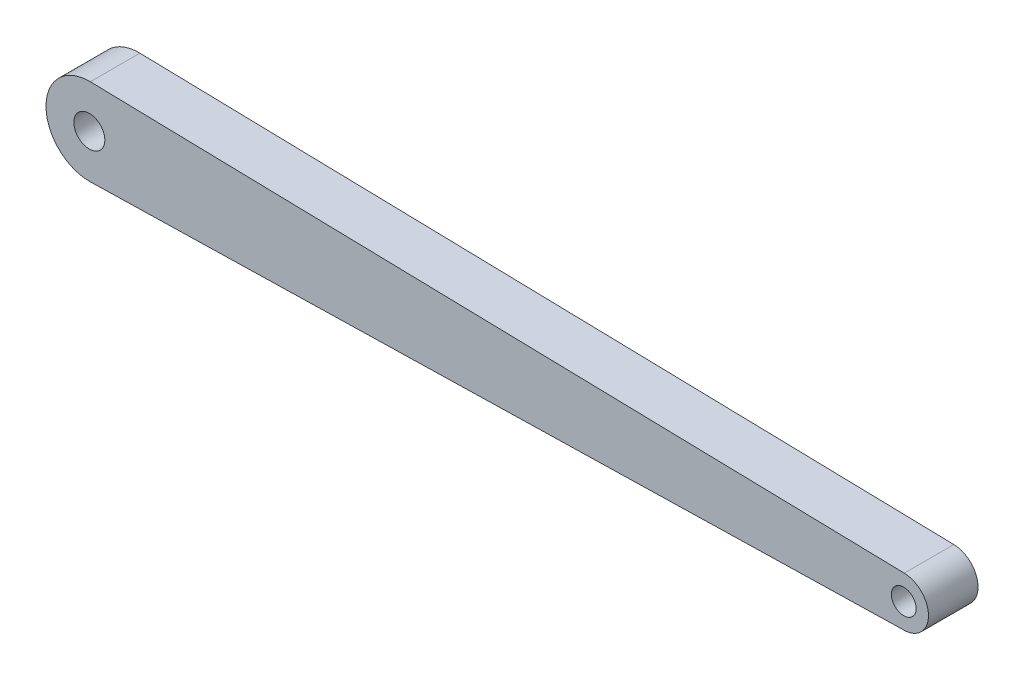
ISO-10303-21;
HEADER;
FILE_DESCRIPTION(('STEP AP214'),'2;1');
FILE_NAME('part.step','',(''),(''),'','','');
FILE_SCHEMA(('AUTOMOTIVE_DESIGN { 1 0 10303 214 1 1 1 1 }'));
ENDSEC;
DATA;
#1=APPLICATION_CONTEXT('core data for automotive mechanical design processes');
#2=APPLICATION_PROTOCOL_DEFINITION('international standard','automotive_design',2000,#1);
#3=PRODUCT_CONTEXT('',#1,'mechanical');
#4=PRODUCT('Part','Part','',(#3));
#5=PRODUCT_RELATED_PRODUCT_CATEGORY('part','',(#4));
#6=PRODUCT_DEFINITION_FORMATION('','',#4);
#7=PRODUCT_DEFINITION_CONTEXT('part definition',#1,'design');
#8=PRODUCT_DEFINITION('design','',#6,#7);
#9=PRODUCT_DEFINITION_SHAPE('','',#8);
#10=(LENGTH_UNIT() NAMED_UNIT(*) SI_UNIT(.MILLI.,.METRE.));
#11=(NAMED_UNIT(*) PLANE_ANGLE_UNIT() SI_UNIT($,.RADIAN.));
#12=(NAMED_UNIT(*) SI_UNIT($,.STERADIAN.) SOLID_ANGLE_UNIT());
#13=UNCERTAINTY_MEASURE_WITH_UNIT(LENGTH_MEASURE(1.E-05),#10,'distance_accuracy_value','');
#14=(GEOMETRIC_REPRESENTATION_CONTEXT(3) GLOBAL_UNCERTAINTY_ASSIGNED_CONTEXT((#13)) GLOBAL_UNIT_ASSIGNED_CONTEXT((#10,
#11,#12)) REPRESENTATION_CONTEXT('',''));
#15=CARTESIAN_POINT('',(0.,0.,0.));
#16=DIRECTION('',(0.,0.,1.));
#17=DIRECTION('',(1.,0.,0.));
#18=AXIS2_PLACEMENT_3D('',#15,#16,#17);
#19=CARTESIAN_POINT('',(-1315.,0.,40.));
#20=DIRECTION('',(0.,0.,1.));
#21=DIRECTION('',(1.,0.,0.));
#22=AXIS2_PLACEMENT_3D('',#19,#20,#21);
#23=PLANE('',#22);
#24=CARTESIAN_POINT('',(0.,0.,40.));
#25=DIRECTION('',(0.,0.,1.));
#26=DIRECTION('',(1.,0.,0.));
#27=AXIS2_PLACEMENT_3D('',#24,#25,#26);
#28=CIRCLE('',#27,20.);
#29=CARTESIAN_POINT('',(20.,0.,40.));
#30=VERTEX_POINT('',#29);
#31=EDGE_CURVE('E106',#30,#30,#28,.T.);
#32=ORIENTED_EDGE('',*,*,#31,.F.);
#33=EDGE_LOOP('',(#32));
#34=FACE_BOUND('',#33,.T.);
#35=CARTESIAN_POINT('',(-1315.,0.,40.));
#36=DIRECTION('',(0.,0.,1.));
#37=DIRECTION('',(1.,0.,0.));
#38=AXIS2_PLACEMENT_3D('',#35,#36,#37);
#39=CIRCLE('',#38,70.);
#40=CARTESIAN_POINT('',(-1313.40304182509,69.9817813762095,40.));
#41=VERTEX_POINT('',#40);
#42=CARTESIAN_POINT('',(-1313.40304182509,-69.9817813762098,40.));
#43=VERTEX_POINT('',#42);
#44=EDGE_CURVE('E91',#41,#43,#39,.T.);
#45=ORIENTED_EDGE('',*,*,#44,.T.);
#46=DIRECTION('',(0.999739733945852,0.0228136882129279,0.));
#47=VECTOR('',#46,1.);
#48=CARTESIAN_POINT('',(-1313.40304182509,-69.9817813762098,40.));
#49=LINE('',#48,#47);
#50=CARTESIAN_POINT('',(0.912547528517138,-39.9895893578341,40.));
#51=VERTEX_POINT('',#50);
#52=EDGE_CURVE('E86',#43,#51,#49,.T.);
#53=ORIENTED_EDGE('',*,*,#52,.T.);
#54=CARTESIAN_POINT('',(0.,0.,40.));
#55=DIRECTION('',(0.,0.,1.));
#56=DIRECTION('',(-1.,0.,0.));
#57=AXIS2_PLACEMENT_3D('',#54,#55,#56);
#58=CIRCLE('',#57,40.);
#59=CARTESIAN_POINT('',(0.912547528517105,39.9895893578341,40.));
#60=VERTEX_POINT('',#59);
#61=EDGE_CURVE('E89',#51,#60,#58,.T.);
#62=ORIENTED_EDGE('',*,*,#61,.T.);
#63=DIRECTION('',(-0.999739733945852,0.0228136882129276,0.));
#64=VECTOR('',#63,1.);
#65=CARTESIAN_POINT('',(-1313.40304182509,69.9817813762095,40.));
#66=LINE('',#65,#64);
#67=EDGE_CURVE('E56',#60,#41,#66,.T.);
#68=ORIENTED_EDGE('',*,*,#67,.T.);
#69=EDGE_LOOP('',(#45,#53,#62,#68));
#70=FACE_BOUND('',#69,.T.);
#71=CARTESIAN_POINT('',(-1315.,0.,40.));
#72=DIRECTION('',(0.,0.,1.));
#73=DIRECTION('',(1.,0.,0.));
#74=AXIS2_PLACEMENT_3D('',#71,#72,#73);
#75=CIRCLE('',#74,25.);
#76=CARTESIAN_POINT('',(-1290.,0.,40.));
#77=VERTEX_POINT('',#76);
#78=EDGE_CURVE('E121',#77,#77,#75,.T.);
#79=ORIENTED_EDGE('',*,*,#78,.F.);
#80=EDGE_LOOP('',(#79));
#81=FACE_BOUND('',#80,.T.);
#82=ADVANCED_FACE('F39',(#34,#70,#81),#23,.T.);
#83=CARTESIAN_POINT('',(-1315.,0.,-40.));
#84=DIRECTION('',(0.,0.,1.));
#85=DIRECTION('',(1.,0.,0.));
#86=AXIS2_PLACEMENT_3D('',#83,#84,#85);
#87=PLANE('',#86);
#88=CARTESIAN_POINT('',(-1315.,0.,-40.));
#89=DIRECTION('',(0.,0.,1.));
#90=DIRECTION('',(1.,0.,0.));
#91=AXIS2_PLACEMENT_3D('',#88,#89,#90);
#92=CIRCLE('',#91,70.);
#93=CARTESIAN_POINT('',(-1313.40304182509,69.9817813762095,-40.));
#94=VERTEX_POINT('',#93);
#95=CARTESIAN_POINT('',(-1313.40304182509,-69.9817813762098,-40.));
#96=VERTEX_POINT('',#95);
#97=EDGE_CURVE('E103',#94,#96,#92,.T.);
#98=ORIENTED_EDGE('',*,*,#97,.F.);
#99=DIRECTION('',(-0.999739733945852,0.0228136882129276,0.));
#100=VECTOR('',#99,1.);
#101=CARTESIAN_POINT('',(-1313.40304182509,69.9817813762095,-40.));
#102=LINE('',#101,#100);
#103=CARTESIAN_POINT('',(0.912547528517105,39.9895893578341,-40.));
#104=VERTEX_POINT('',#103);
#105=EDGE_CURVE('E79',#104,#94,#102,.T.);
#106=ORIENTED_EDGE('',*,*,#105,.F.);
#107=CARTESIAN_POINT('',(0.,0.,-40.));
#108=DIRECTION('',(0.,0.,1.));
#109=DIRECTION('',(-1.,0.,0.));
#110=AXIS2_PLACEMENT_3D('',#107,#108,#109);
#111=CIRCLE('',#110,40.);
#112=CARTESIAN_POINT('',(0.912547528517138,-39.9895893578341,-40.));
#113=VERTEX_POINT('',#112);
#114=EDGE_CURVE('E73',#113,#104,#111,.T.);
#115=ORIENTED_EDGE('',*,*,#114,.F.);
#116=DIRECTION('',(0.999739733945852,0.0228136882129279,0.));
#117=VECTOR('',#116,1.);
#118=CARTESIAN_POINT('',(-1313.40304182509,-69.9817813762098,-40.));
#119=LINE('',#118,#117);
#120=EDGE_CURVE('E95',#96,#113,#119,.T.);
#121=ORIENTED_EDGE('',*,*,#120,.F.);
#122=EDGE_LOOP('',(#98,#106,#115,#121));
#123=FACE_BOUND('',#122,.T.);
#124=CARTESIAN_POINT('',(0.,0.,-40.));
#125=DIRECTION('',(0.,0.,1.));
#126=DIRECTION('',(1.,0.,0.));
#127=AXIS2_PLACEMENT_3D('',#124,#125,#126);
#128=CIRCLE('',#127,20.);
#129=CARTESIAN_POINT('',(20.,0.,-40.));
#130=VERTEX_POINT('',#129);
#131=EDGE_CURVE('E118',#130,#130,#128,.T.);
#132=ORIENTED_EDGE('',*,*,#131,.T.);
#133=EDGE_LOOP('',(#132));
#134=FACE_BOUND('',#133,.T.);
#135=CARTESIAN_POINT('',(-1315.,0.,-40.));
#136=DIRECTION('',(0.,0.,1.));
#137=DIRECTION('',(1.,0.,0.));
#138=AXIS2_PLACEMENT_3D('',#135,#136,#137);
#139=CIRCLE('',#138,25.);
#140=CARTESIAN_POINT('',(-1290.,0.,-40.));
#141=VERTEX_POINT('',#140);
#142=EDGE_CURVE('E124',#141,#141,#139,.T.);
#143=ORIENTED_EDGE('',*,*,#142,.T.);
#144=EDGE_LOOP('',(#143));
#145=FACE_BOUND('',#144,.T.);
#146=ADVANCED_FACE('F114',(#123,#134,#145),#87,.F.);
#147=CARTESIAN_POINT('',(-1315.,0.,40.));
#148=DIRECTION('',(0.,0.,-1.));
#149=DIRECTION('',(-1.,0.,0.));
#150=AXIS2_PLACEMENT_3D('',#147,#148,#149);
#151=CYLINDRICAL_SURFACE('',#150,70.);
#152=ORIENTED_EDGE('',*,*,#97,.T.);
#153=DIRECTION('',(0.,0.,-1.));
#154=VECTOR('',#153,1.);
#155=CARTESIAN_POINT('',(-1313.40304182509,-69.9817813762098,40.));
#156=LINE('',#155,#154);
#157=EDGE_CURVE('E11',#43,#96,#156,.T.);
#158=ORIENTED_EDGE('',*,*,#157,.F.);
#159=ORIENTED_EDGE('',*,*,#44,.F.);
#160=DIRECTION('',(0.,0.,-1.));
#161=VECTOR('',#160,1.);
#162=CARTESIAN_POINT('',(-1313.40304182509,69.9817813762095,40.));
#163=LINE('',#162,#161);
#164=EDGE_CURVE('E99',#41,#94,#163,.T.);
#165=ORIENTED_EDGE('',*,*,#164,.T.);
#166=EDGE_LOOP('',(#152,#158,#159,#165));
#167=FACE_BOUND('',#166,.T.);
#168=ADVANCED_FACE('F41',(#167),#151,.T.);
#169=CARTESIAN_POINT('',(-1313.40304182509,-69.9817813762098,40.));
#170=DIRECTION('',(-0.0228136882129279,0.999739733945852,0.));
#171=DIRECTION('',(-0.999739733945852,-0.0228136882129279,0.));
#172=AXIS2_PLACEMENT_3D('',#169,#170,#171);
#173=PLANE('',#172);
#174=ORIENTED_EDGE('',*,*,#120,.T.);
#175=DIRECTION('',(0.,0.,-1.));
#176=VECTOR('',#175,1.);
#177=CARTESIAN_POINT('',(0.912547528517138,-39.9895893578341,40.));
#178=LINE('',#177,#176);
#179=EDGE_CURVE('E48',#51,#113,#178,.T.);
#180=ORIENTED_EDGE('',*,*,#179,.F.);
#181=ORIENTED_EDGE('',*,*,#52,.F.);
#182=ORIENTED_EDGE('',*,*,#157,.T.);
#183=EDGE_LOOP('',(#174,#180,#181,#182));
#184=FACE_BOUND('',#183,.T.);
#185=ADVANCED_FACE('F94',(#184),#173,.F.);
#186=CARTESIAN_POINT('',(0.,0.,40.));
#187=DIRECTION('',(0.,0.,-1.));
#188=DIRECTION('',(-1.,0.,0.));
#189=AXIS2_PLACEMENT_3D('',#186,#187,#188);
#190=CYLINDRICAL_SURFACE('',#189,40.);
#191=ORIENTED_EDGE('',*,*,#114,.T.);
#192=DIRECTION('',(0.,0.,-1.));
#193=VECTOR('',#192,1.);
#194=CARTESIAN_POINT('',(0.912547528517105,39.9895893578341,40.));
#195=LINE('',#194,#193);
#196=EDGE_CURVE('E96',#60,#104,#195,.T.);
#197=ORIENTED_EDGE('',*,*,#196,.F.);
#198=ORIENTED_EDGE('',*,*,#61,.F.);
#199=ORIENTED_EDGE('',*,*,#179,.T.);
#200=EDGE_LOOP('',(#191,#197,#198,#199));
#201=FACE_BOUND('',#200,.T.);
#202=ADVANCED_FACE('F97',(#201),#190,.T.);
#203=CARTESIAN_POINT('',(-1313.40304182509,69.9817813762095,40.));
#204=DIRECTION('',(-0.0228136882129276,-0.999739733945852,0.));
#205=DIRECTION('',(0.999739733945852,-0.0228136882129276,0.));
#206=AXIS2_PLACEMENT_3D('',#203,#204,#205);
#207=PLANE('',#206);
#208=ORIENTED_EDGE('',*,*,#105,.T.);
#209=ORIENTED_EDGE('',*,*,#164,.F.);
#210=ORIENTED_EDGE('',*,*,#67,.F.);
#211=ORIENTED_EDGE('',*,*,#196,.T.);
#212=EDGE_LOOP('',(#208,#209,#210,#211));
#213=FACE_BOUND('',#212,.T.);
#214=ADVANCED_FACE('F111',(#213),#207,.F.);
#215=CARTESIAN_POINT('',(0.,0.,40.));
#216=DIRECTION('',(0.,0.,-1.));
#217=DIRECTION('',(-1.,0.,0.));
#218=AXIS2_PLACEMENT_3D('',#215,#216,#217);
#219=CYLINDRICAL_SURFACE('',#218,20.);
#220=ORIENTED_EDGE('',*,*,#31,.T.);
#221=EDGE_LOOP('',(#220));
#222=FACE_BOUND('',#221,.T.);
#223=ORIENTED_EDGE('',*,*,#131,.F.);
#224=EDGE_LOOP('',(#223));
#225=FACE_BOUND('',#224,.T.);
#226=ADVANCED_FACE('F141',(#222,#225),#219,.F.);
#227=CARTESIAN_POINT('',(-1315.,0.,40.));
#228=DIRECTION('',(0.,0.,-1.));
#229=DIRECTION('',(-1.,0.,0.));
#230=AXIS2_PLACEMENT_3D('',#227,#228,#229);
#231=CYLINDRICAL_SURFACE('',#230,25.);
#232=ORIENTED_EDGE('',*,*,#78,.T.);
#233=EDGE_LOOP('',(#232));
#234=FACE_BOUND('',#233,.T.);
#235=ORIENTED_EDGE('',*,*,#142,.F.);
#236=EDGE_LOOP('',(#235));
#237=FACE_BOUND('',#236,.T.);
#238=ADVANCED_FACE('F130',(#234,#237),#231,.F.);
#239=CLOSED_SHELL('',(#82,#146,#168,#185,#202,#214,#226,#238));
#240=MANIFOLD_SOLID_BREP('B2',#239);
#241=ADVANCED_BREP_SHAPE_REPRESENTATION('',(#18,#240),#14);
#242=SHAPE_DEFINITION_REPRESENTATION(#9,#241);
ENDSEC;
END-ISO-10303-21;
